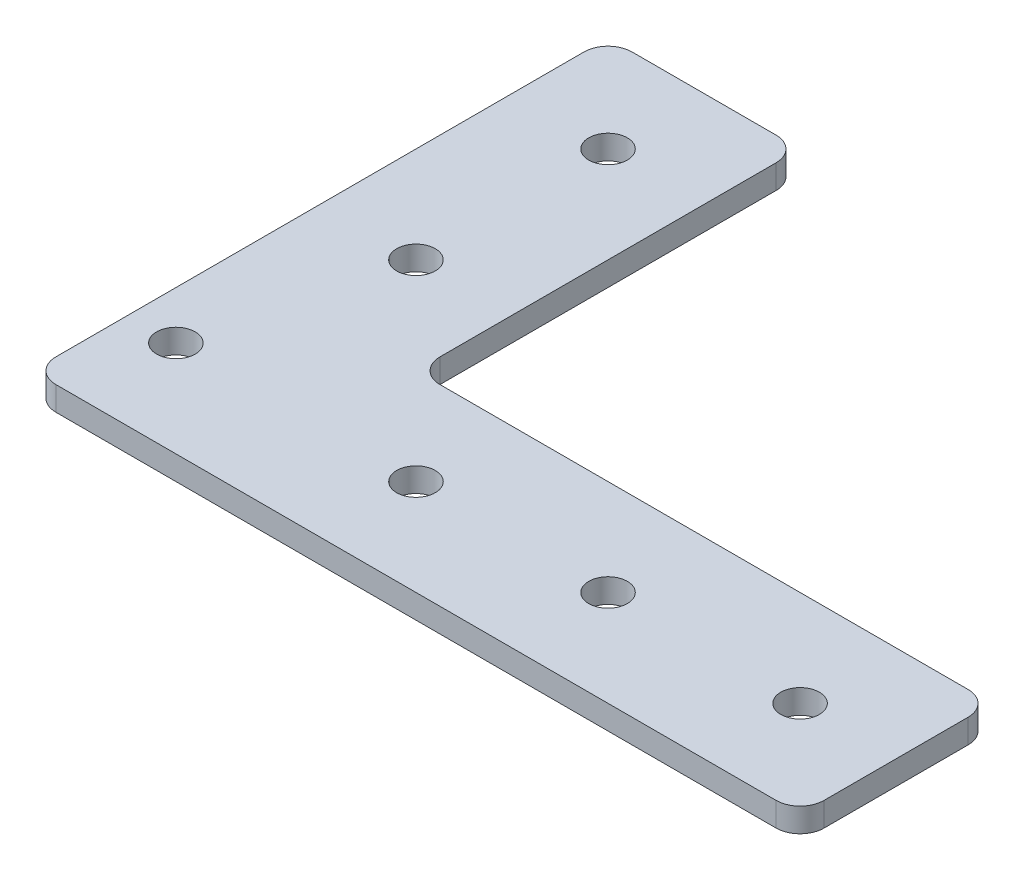
ISO-10303-21;
HEADER;
FILE_DESCRIPTION(('STEP AP214'),'2;1');
FILE_NAME('part.step','',(''),(''),'','','');
FILE_SCHEMA(('AUTOMOTIVE_DESIGN { 1 0 10303 214 1 1 1 1 }'));
ENDSEC;
DATA;
#1=APPLICATION_CONTEXT('core data for automotive mechanical design processes');
#2=APPLICATION_PROTOCOL_DEFINITION('international standard','automotive_design',2000,#1);
#3=PRODUCT_CONTEXT('',#1,'mechanical');
#4=PRODUCT('Part','Part','',(#3));
#5=PRODUCT_RELATED_PRODUCT_CATEGORY('part','',(#4));
#6=PRODUCT_DEFINITION_FORMATION('','',#4);
#7=PRODUCT_DEFINITION_CONTEXT('part definition',#1,'design');
#8=PRODUCT_DEFINITION('design','',#6,#7);
#9=PRODUCT_DEFINITION_SHAPE('','',#8);
#10=(LENGTH_UNIT() NAMED_UNIT(*) SI_UNIT(.MILLI.,.METRE.));
#11=(NAMED_UNIT(*) PLANE_ANGLE_UNIT() SI_UNIT($,.RADIAN.));
#12=(NAMED_UNIT(*) SI_UNIT($,.STERADIAN.) SOLID_ANGLE_UNIT());
#13=UNCERTAINTY_MEASURE_WITH_UNIT(LENGTH_MEASURE(1.E-05),#10,'distance_accuracy_value','');
#14=(GEOMETRIC_REPRESENTATION_CONTEXT(3) GLOBAL_UNCERTAINTY_ASSIGNED_CONTEXT((#13)) GLOBAL_UNIT_ASSIGNED_CONTEXT((#10,
#11,#12)) REPRESENTATION_CONTEXT('',''));
#15=CARTESIAN_POINT('',(0.,0.,0.));
#16=DIRECTION('',(0.,0.,1.));
#17=DIRECTION('',(1.,0.,0.));
#18=AXIS2_PLACEMENT_3D('',#15,#16,#17);
#19=CARTESIAN_POINT('',(101.6,3.175,0.));
#20=DIRECTION('',(0.,0.,-1.));
#21=DIRECTION('',(-1.,0.,0.));
#22=AXIS2_PLACEMENT_3D('',#19,#20,#21);
#23=PLANE('',#22);
#24=DIRECTION('',(1.,0.,0.));
#25=VECTOR('',#24,1.);
#26=CARTESIAN_POINT('',(101.6,3.175,0.));
#27=LINE('',#26,#25);
#28=CARTESIAN_POINT('',(3.175,3.175,0.));
#29=VERTEX_POINT('',#28);
#30=CARTESIAN_POINT('',(98.425,3.175,0.));
#31=VERTEX_POINT('',#30);
#32=EDGE_CURVE('E194',#29,#31,#27,.T.);
#33=ORIENTED_EDGE('',*,*,#32,.F.);
#34=DIRECTION('',(0.,-1.,0.));
#35=VECTOR('',#34,1.);
#36=CARTESIAN_POINT('',(3.175,3.175,0.));
#37=LINE('',#36,#35);
#38=CARTESIAN_POINT('',(3.175,0.,0.));
#39=VERTEX_POINT('',#38);
#40=EDGE_CURVE('E218',#29,#39,#37,.T.);
#41=ORIENTED_EDGE('',*,*,#40,.T.);
#42=DIRECTION('',(1.,0.,0.));
#43=VECTOR('',#42,1.);
#44=CARTESIAN_POINT('',(101.6,0.,0.));
#45=LINE('',#44,#43);
#46=CARTESIAN_POINT('',(98.425,0.,0.));
#47=VERTEX_POINT('',#46);
#48=EDGE_CURVE('E193',#39,#47,#45,.T.);
#49=ORIENTED_EDGE('',*,*,#48,.T.);
#50=DIRECTION('',(0.,-1.,0.));
#51=VECTOR('',#50,1.);
#52=CARTESIAN_POINT('',(98.425,3.175,0.));
#53=LINE('',#52,#51);
#54=EDGE_CURVE('E216',#47,#31,#53,.F.);
#55=ORIENTED_EDGE('',*,*,#54,.T.);
#56=EDGE_LOOP('',(#33,#41,#49,#55));
#57=FACE_BOUND('',#56,.T.);
#58=ADVANCED_FACE('F34',(#57),#23,.F.);
#59=CARTESIAN_POINT('',(101.6,3.175,-25.4));
#60=DIRECTION('',(-1.,0.,0.));
#61=DIRECTION('',(0.,0.,1.));
#62=AXIS2_PLACEMENT_3D('',#59,#60,#61);
#63=PLANE('',#62);
#64=DIRECTION('',(0.,0.,-1.));
#65=VECTOR('',#64,1.);
#66=CARTESIAN_POINT('',(101.6,3.175,-25.4));
#67=LINE('',#66,#65);
#68=CARTESIAN_POINT('',(101.6,3.175,-3.175));
#69=VERTEX_POINT('',#68);
#70=CARTESIAN_POINT('',(101.6,3.175,-22.225));
#71=VERTEX_POINT('',#70);
#72=EDGE_CURVE('E197',#69,#71,#67,.T.);
#73=ORIENTED_EDGE('',*,*,#72,.F.);
#74=DIRECTION('',(0.,-1.,0.));
#75=VECTOR('',#74,1.);
#76=CARTESIAN_POINT('',(101.6,3.175,-3.175));
#77=LINE('',#76,#75);
#78=CARTESIAN_POINT('',(101.6,0.,-3.175));
#79=VERTEX_POINT('',#78);
#80=EDGE_CURVE('E246',#69,#79,#77,.T.);
#81=ORIENTED_EDGE('',*,*,#80,.T.);
#82=DIRECTION('',(0.,0.,-1.));
#83=VECTOR('',#82,1.);
#84=CARTESIAN_POINT('',(101.6,0.,-25.4));
#85=LINE('',#84,#83);
#86=CARTESIAN_POINT('',(101.6,0.,-22.225));
#87=VERTEX_POINT('',#86);
#88=EDGE_CURVE('E206',#79,#87,#85,.T.);
#89=ORIENTED_EDGE('',*,*,#88,.T.);
#90=DIRECTION('',(0.,-1.,0.));
#91=VECTOR('',#90,1.);
#92=CARTESIAN_POINT('',(101.6,3.175,-22.225));
#93=LINE('',#92,#91);
#94=EDGE_CURVE('E244',#87,#71,#93,.F.);
#95=ORIENTED_EDGE('',*,*,#94,.T.);
#96=EDGE_LOOP('',(#73,#81,#89,#95));
#97=FACE_BOUND('',#96,.T.);
#98=ADVANCED_FACE('F282',(#97),#63,.F.);
#99=CARTESIAN_POINT('',(0.,3.175,-76.2));
#100=DIRECTION('',(0.,0.,1.));
#101=DIRECTION('',(1.,0.,0.));
#102=AXIS2_PLACEMENT_3D('',#99,#100,#101);
#103=PLANE('',#102);
#104=DIRECTION('',(-1.,0.,0.));
#105=VECTOR('',#104,1.);
#106=CARTESIAN_POINT('',(0.,3.175,-76.2));
#107=LINE('',#106,#105);
#108=CARTESIAN_POINT('',(22.225,3.175,-76.2));
#109=VERTEX_POINT('',#108);
#110=CARTESIAN_POINT('',(3.175,3.175,-76.2));
#111=VERTEX_POINT('',#110);
#112=EDGE_CURVE('E200',#109,#111,#107,.T.);
#113=ORIENTED_EDGE('',*,*,#112,.F.);
#114=DIRECTION('',(0.,-1.,0.));
#115=VECTOR('',#114,1.);
#116=CARTESIAN_POINT('',(22.225,3.175,-76.2));
#117=LINE('',#116,#115);
#118=CARTESIAN_POINT('',(22.225,0.,-76.2));
#119=VERTEX_POINT('',#118);
#120=EDGE_CURVE('E131',#109,#119,#117,.T.);
#121=ORIENTED_EDGE('',*,*,#120,.T.);
#122=DIRECTION('',(-1.,0.,0.));
#123=VECTOR('',#122,1.);
#124=CARTESIAN_POINT('',(0.,0.,-76.2));
#125=LINE('',#124,#123);
#126=CARTESIAN_POINT('',(3.175,0.,-76.2));
#127=VERTEX_POINT('',#126);
#128=EDGE_CURVE('E209',#119,#127,#125,.T.);
#129=ORIENTED_EDGE('',*,*,#128,.T.);
#130=DIRECTION('',(0.,-1.,0.));
#131=VECTOR('',#130,1.);
#132=CARTESIAN_POINT('',(3.175,3.175,-76.2));
#133=LINE('',#132,#131);
#134=EDGE_CURVE('E49',#127,#111,#133,.F.);
#135=ORIENTED_EDGE('',*,*,#134,.T.);
#136=EDGE_LOOP('',(#113,#121,#129,#135));
#137=FACE_BOUND('',#136,.T.);
#138=ADVANCED_FACE('F253',(#137),#103,.F.);
#139=CARTESIAN_POINT('',(0.,3.175,0.));
#140=DIRECTION('',(1.,0.,0.));
#141=DIRECTION('',(0.,0.,-1.));
#142=AXIS2_PLACEMENT_3D('',#139,#140,#141);
#143=PLANE('',#142);
#144=DIRECTION('',(0.,0.,1.));
#145=VECTOR('',#144,1.);
#146=CARTESIAN_POINT('',(0.,0.,0.));
#147=LINE('',#146,#145);
#148=CARTESIAN_POINT('',(0.,0.,-73.025));
#149=VERTEX_POINT('',#148);
#150=CARTESIAN_POINT('',(0.,0.,-3.175));
#151=VERTEX_POINT('',#150);
#152=EDGE_CURVE('E198',#149,#151,#147,.T.);
#153=ORIENTED_EDGE('',*,*,#152,.T.);
#154=DIRECTION('',(0.,-1.,0.));
#155=VECTOR('',#154,1.);
#156=CARTESIAN_POINT('',(0.,3.175,-3.175));
#157=LINE('',#156,#155);
#158=CARTESIAN_POINT('',(0.,3.175,-3.175));
#159=VERTEX_POINT('',#158);
#160=EDGE_CURVE('E234',#151,#159,#157,.F.);
#161=ORIENTED_EDGE('',*,*,#160,.T.);
#162=DIRECTION('',(0.,0.,1.));
#163=VECTOR('',#162,1.);
#164=CARTESIAN_POINT('',(0.,3.175,0.));
#165=LINE('',#164,#163);
#166=CARTESIAN_POINT('',(0.,3.175,-73.025));
#167=VERTEX_POINT('',#166);
#168=EDGE_CURVE('E202',#167,#159,#165,.T.);
#169=ORIENTED_EDGE('',*,*,#168,.F.);
#170=DIRECTION('',(0.,-1.,0.));
#171=VECTOR('',#170,1.);
#172=CARTESIAN_POINT('',(0.,3.175,-73.025));
#173=LINE('',#172,#171);
#174=EDGE_CURVE('E231',#167,#149,#173,.T.);
#175=ORIENTED_EDGE('',*,*,#174,.T.);
#176=EDGE_LOOP('',(#153,#161,#169,#175));
#177=FACE_BOUND('',#176,.T.);
#178=ADVANCED_FACE('F266',(#177),#143,.F.);
#179=CARTESIAN_POINT('',(0.,3.175,0.));
#180=DIRECTION('',(0.,-1.,0.));
#181=DIRECTION('',(0.,0.,-1.));
#182=AXIS2_PLACEMENT_3D('',#179,#180,#181);
#183=PLANE('',#182);
#184=CARTESIAN_POINT('',(6.35,3.175,-12.7));
#185=DIRECTION('',(0.,1.,0.));
#186=DIRECTION('',(0.,0.,1.));
#187=AXIS2_PLACEMENT_3D('',#184,#185,#186);
#188=CIRCLE('',#187,2.55269999999999);
#189=CARTESIAN_POINT('',(6.35,3.175,-10.1473));
#190=VERTEX_POINT('',#189);
#191=EDGE_CURVE('E157',#190,#190,#188,.T.);
#192=ORIENTED_EDGE('',*,*,#191,.F.);
#193=EDGE_LOOP('',(#192));
#194=FACE_BOUND('',#193,.T.);
#195=CARTESIAN_POINT('',(12.7,3.175,-63.5));
#196=DIRECTION('',(0.,1.,0.));
#197=DIRECTION('',(0.,0.,1.));
#198=AXIS2_PLACEMENT_3D('',#195,#196,#197);
#199=CIRCLE('',#198,2.5527);
#200=CARTESIAN_POINT('',(12.7,3.175,-60.9473));
#201=VERTEX_POINT('',#200);
#202=EDGE_CURVE('E163',#201,#201,#199,.T.);
#203=ORIENTED_EDGE('',*,*,#202,.F.);
#204=EDGE_LOOP('',(#203));
#205=FACE_BOUND('',#204,.T.);
#206=CARTESIAN_POINT('',(12.7,3.175,-38.1));
#207=DIRECTION('',(0.,1.,0.));
#208=DIRECTION('',(0.,0.,1.));
#209=AXIS2_PLACEMENT_3D('',#206,#207,#208);
#210=CIRCLE('',#209,2.5527);
#211=CARTESIAN_POINT('',(12.7,3.175,-35.5473));
#212=VERTEX_POINT('',#211);
#213=EDGE_CURVE('E169',#212,#212,#210,.T.);
#214=ORIENTED_EDGE('',*,*,#213,.F.);
#215=EDGE_LOOP('',(#214));
#216=FACE_BOUND('',#215,.T.);
#217=CARTESIAN_POINT('',(38.1,3.175,-12.7));
#218=DIRECTION('',(0.,1.,0.));
#219=DIRECTION('',(0.,0.,1.));
#220=AXIS2_PLACEMENT_3D('',#217,#218,#219);
#221=CIRCLE('',#220,2.5527);
#222=CARTESIAN_POINT('',(38.1,3.175,-10.1473));
#223=VERTEX_POINT('',#222);
#224=EDGE_CURVE('E175',#223,#223,#221,.T.);
#225=ORIENTED_EDGE('',*,*,#224,.F.);
#226=EDGE_LOOP('',(#225));
#227=FACE_BOUND('',#226,.T.);
#228=CARTESIAN_POINT('',(63.5,3.175,-12.7));
#229=DIRECTION('',(0.,1.,0.));
#230=DIRECTION('',(0.,0.,1.));
#231=AXIS2_PLACEMENT_3D('',#228,#229,#230);
#232=CIRCLE('',#231,2.55269999999999);
#233=CARTESIAN_POINT('',(63.5,3.175,-10.1473));
#234=VERTEX_POINT('',#233);
#235=EDGE_CURVE('E181',#234,#234,#232,.T.);
#236=ORIENTED_EDGE('',*,*,#235,.F.);
#237=EDGE_LOOP('',(#236));
#238=FACE_BOUND('',#237,.T.);
#239=CARTESIAN_POINT('',(88.9,3.175,-12.7));
#240=DIRECTION('',(0.,1.,0.));
#241=DIRECTION('',(0.,0.,1.));
#242=AXIS2_PLACEMENT_3D('',#239,#240,#241);
#243=CIRCLE('',#242,2.55269999999999);
#244=CARTESIAN_POINT('',(88.9,3.175,-10.1473));
#245=VERTEX_POINT('',#244);
#246=EDGE_CURVE('E187',#245,#245,#243,.T.);
#247=ORIENTED_EDGE('',*,*,#246,.F.);
#248=EDGE_LOOP('',(#247));
#249=FACE_BOUND('',#248,.T.);
#250=ORIENTED_EDGE('',*,*,#168,.T.);
#251=CARTESIAN_POINT('',(3.175,3.175,-3.175));
#252=DIRECTION('',(0.,-1.,0.));
#253=DIRECTION('',(0.,0.,-1.));
#254=AXIS2_PLACEMENT_3D('',#251,#252,#253);
#255=CIRCLE('',#254,3.175);
#256=EDGE_CURVE('E242',#159,#29,#255,.F.);
#257=ORIENTED_EDGE('',*,*,#256,.T.);
#258=ORIENTED_EDGE('',*,*,#32,.T.);
#259=CARTESIAN_POINT('',(98.425,3.175,-3.175));
#260=DIRECTION('',(0.,-1.,0.));
#261=DIRECTION('',(0.,0.,-1.));
#262=AXIS2_PLACEMENT_3D('',#259,#260,#261);
#263=CIRCLE('',#262,3.175);
#264=EDGE_CURVE('E240',#31,#69,#263,.F.);
#265=ORIENTED_EDGE('',*,*,#264,.T.);
#266=ORIENTED_EDGE('',*,*,#72,.T.);
#267=CARTESIAN_POINT('',(98.425,3.175,-22.225));
#268=DIRECTION('',(0.,-1.,0.));
#269=DIRECTION('',(0.,0.,-1.));
#270=AXIS2_PLACEMENT_3D('',#267,#268,#269);
#271=CIRCLE('',#270,3.175);
#272=CARTESIAN_POINT('',(98.425,3.175,-25.4));
#273=VERTEX_POINT('',#272);
#274=EDGE_CURVE('E148',#71,#273,#271,.F.);
#275=ORIENTED_EDGE('',*,*,#274,.T.);
#276=DIRECTION('',(1.,0.,0.));
#277=VECTOR('',#276,1.);
#278=CARTESIAN_POINT('',(25.4,3.175,-25.4));
#279=LINE('',#278,#277);
#280=CARTESIAN_POINT('',(28.575,3.175,-25.4));
#281=VERTEX_POINT('',#280);
#282=EDGE_CURVE('E137',#281,#273,#279,.T.);
#283=ORIENTED_EDGE('',*,*,#282,.F.);
#284=CARTESIAN_POINT('',(28.575,3.175,-28.575));
#285=DIRECTION('',(0.,-1.,0.));
#286=DIRECTION('',(0.,0.,-1.));
#287=AXIS2_PLACEMENT_3D('',#284,#285,#286);
#288=CIRCLE('',#287,3.175);
#289=CARTESIAN_POINT('',(25.4,3.175,-28.575));
#290=VERTEX_POINT('',#289);
#291=EDGE_CURVE('E42',#281,#290,#288,.T.);
#292=ORIENTED_EDGE('',*,*,#291,.T.);
#293=DIRECTION('',(0.,0.,1.));
#294=VECTOR('',#293,1.);
#295=CARTESIAN_POINT('',(25.4,3.175,-76.2));
#296=LINE('',#295,#294);
#297=CARTESIAN_POINT('',(25.4,3.175,-73.025));
#298=VERTEX_POINT('',#297);
#299=EDGE_CURVE('E150',#298,#290,#296,.T.);
#300=ORIENTED_EDGE('',*,*,#299,.F.);
#301=CARTESIAN_POINT('',(22.225,3.175,-73.025));
#302=DIRECTION('',(0.,-1.,0.));
#303=DIRECTION('',(0.,0.,-1.));
#304=AXIS2_PLACEMENT_3D('',#301,#302,#303);
#305=CIRCLE('',#304,3.175);
#306=EDGE_CURVE('E56',#298,#109,#305,.F.);
#307=ORIENTED_EDGE('',*,*,#306,.T.);
#308=ORIENTED_EDGE('',*,*,#112,.T.);
#309=CARTESIAN_POINT('',(3.175,3.175,-73.025));
#310=DIRECTION('',(0.,-1.,0.));
#311=DIRECTION('',(0.,0.,-1.));
#312=AXIS2_PLACEMENT_3D('',#309,#310,#311);
#313=CIRCLE('',#312,3.175);
#314=EDGE_CURVE('E236',#111,#167,#313,.F.);
#315=ORIENTED_EDGE('',*,*,#314,.T.);
#316=EDGE_LOOP('',(#250,#257,#258,#265,#266,#275,#283,#292,#300,#307,#308,#315));
#317=FACE_BOUND('',#316,.T.);
#318=ADVANCED_FACE('F145',(#194,#205,#216,#227,#238,#249,#317),#183,.F.);
#319=CARTESIAN_POINT('',(0.,0.,0.));
#320=DIRECTION('',(0.,-1.,0.));
#321=DIRECTION('',(0.,0.,-1.));
#322=AXIS2_PLACEMENT_3D('',#319,#320,#321);
#323=PLANE('',#322);
#324=ORIENTED_EDGE('',*,*,#48,.F.);
#325=CARTESIAN_POINT('',(3.175,0.,-3.175));
#326=DIRECTION('',(0.,-1.,0.));
#327=DIRECTION('',(0.,0.,-1.));
#328=AXIS2_PLACEMENT_3D('',#325,#326,#327);
#329=CIRCLE('',#328,3.175);
#330=EDGE_CURVE('E229',#39,#151,#329,.T.);
#331=ORIENTED_EDGE('',*,*,#330,.T.);
#332=ORIENTED_EDGE('',*,*,#152,.F.);
#333=CARTESIAN_POINT('',(3.175,0.,-73.025));
#334=DIRECTION('',(0.,-1.,0.));
#335=DIRECTION('',(0.,0.,-1.));
#336=AXIS2_PLACEMENT_3D('',#333,#334,#335);
#337=CIRCLE('',#336,3.175);
#338=EDGE_CURVE('E221',#149,#127,#337,.T.);
#339=ORIENTED_EDGE('',*,*,#338,.T.);
#340=ORIENTED_EDGE('',*,*,#128,.F.);
#341=CARTESIAN_POINT('',(22.225,0.,-73.025));
#342=DIRECTION('',(0.,-1.,0.));
#343=DIRECTION('',(0.,0.,-1.));
#344=AXIS2_PLACEMENT_3D('',#341,#342,#343);
#345=CIRCLE('',#344,3.175);
#346=CARTESIAN_POINT('',(25.4,0.,-73.025));
#347=VERTEX_POINT('',#346);
#348=EDGE_CURVE('E223',#119,#347,#345,.T.);
#349=ORIENTED_EDGE('',*,*,#348,.T.);
#350=DIRECTION('',(0.,0.,1.));
#351=VECTOR('',#350,1.);
#352=CARTESIAN_POINT('',(25.4,0.,-76.2));
#353=LINE('',#352,#351);
#354=CARTESIAN_POINT('',(25.4,0.,-28.575));
#355=VERTEX_POINT('',#354);
#356=EDGE_CURVE('E149',#347,#355,#353,.T.);
#357=ORIENTED_EDGE('',*,*,#356,.T.);
#358=CARTESIAN_POINT('',(28.575,0.,-28.575));
#359=DIRECTION('',(0.,-1.,0.));
#360=DIRECTION('',(0.,0.,-1.));
#361=AXIS2_PLACEMENT_3D('',#358,#359,#360);
#362=CIRCLE('',#361,3.175);
#363=CARTESIAN_POINT('',(28.575,0.,-25.4));
#364=VERTEX_POINT('',#363);
#365=EDGE_CURVE('E11',#355,#364,#362,.F.);
#366=ORIENTED_EDGE('',*,*,#365,.T.);
#367=DIRECTION('',(1.,0.,0.));
#368=VECTOR('',#367,1.);
#369=CARTESIAN_POINT('',(25.4,0.,-25.4));
#370=LINE('',#369,#368);
#371=CARTESIAN_POINT('',(98.425,0.,-25.4));
#372=VERTEX_POINT('',#371);
#373=EDGE_CURVE('E140',#364,#372,#370,.T.);
#374=ORIENTED_EDGE('',*,*,#373,.T.);
#375=CARTESIAN_POINT('',(98.425,0.,-22.225));
#376=DIRECTION('',(0.,-1.,0.));
#377=DIRECTION('',(0.,0.,-1.));
#378=AXIS2_PLACEMENT_3D('',#375,#376,#377);
#379=CIRCLE('',#378,3.175);
#380=EDGE_CURVE('E225',#372,#87,#379,.T.);
#381=ORIENTED_EDGE('',*,*,#380,.T.);
#382=ORIENTED_EDGE('',*,*,#88,.F.);
#383=CARTESIAN_POINT('',(98.425,0.,-3.175));
#384=DIRECTION('',(0.,-1.,0.));
#385=DIRECTION('',(0.,0.,-1.));
#386=AXIS2_PLACEMENT_3D('',#383,#384,#385);
#387=CIRCLE('',#386,3.175);
#388=EDGE_CURVE('E227',#79,#47,#387,.T.);
#389=ORIENTED_EDGE('',*,*,#388,.T.);
#390=EDGE_LOOP('',(#324,#331,#332,#339,#340,#349,#357,#366,#374,#381,#382,#389));
#391=FACE_BOUND('',#390,.T.);
#392=CARTESIAN_POINT('',(6.35,0.,-12.7));
#393=DIRECTION('',(0.,1.,0.));
#394=DIRECTION('',(0.,0.,1.));
#395=AXIS2_PLACEMENT_3D('',#392,#393,#394);
#396=CIRCLE('',#395,2.5527);
#397=CARTESIAN_POINT('',(6.35,0.,-10.1473));
#398=VERTEX_POINT('',#397);
#399=EDGE_CURVE('E160',#398,#398,#396,.T.);
#400=ORIENTED_EDGE('',*,*,#399,.T.);
#401=EDGE_LOOP('',(#400));
#402=FACE_BOUND('',#401,.T.);
#403=CARTESIAN_POINT('',(12.7,0.,-63.5));
#404=DIRECTION('',(0.,1.,0.));
#405=DIRECTION('',(0.,0.,1.));
#406=AXIS2_PLACEMENT_3D('',#403,#404,#405);
#407=CIRCLE('',#406,2.5527);
#408=CARTESIAN_POINT('',(12.7,0.,-60.9473));
#409=VERTEX_POINT('',#408);
#410=EDGE_CURVE('E166',#409,#409,#407,.T.);
#411=ORIENTED_EDGE('',*,*,#410,.T.);
#412=EDGE_LOOP('',(#411));
#413=FACE_BOUND('',#412,.T.);
#414=CARTESIAN_POINT('',(12.7,0.,-38.1));
#415=DIRECTION('',(0.,1.,0.));
#416=DIRECTION('',(0.,0.,1.));
#417=AXIS2_PLACEMENT_3D('',#414,#415,#416);
#418=CIRCLE('',#417,2.5527);
#419=CARTESIAN_POINT('',(12.7,0.,-35.5473));
#420=VERTEX_POINT('',#419);
#421=EDGE_CURVE('E172',#420,#420,#418,.T.);
#422=ORIENTED_EDGE('',*,*,#421,.T.);
#423=EDGE_LOOP('',(#422));
#424=FACE_BOUND('',#423,.T.);
#425=CARTESIAN_POINT('',(38.1,0.,-12.7));
#426=DIRECTION('',(0.,1.,0.));
#427=DIRECTION('',(0.,0.,1.));
#428=AXIS2_PLACEMENT_3D('',#425,#426,#427);
#429=CIRCLE('',#428,2.5527);
#430=CARTESIAN_POINT('',(38.1,0.,-10.1473));
#431=VERTEX_POINT('',#430);
#432=EDGE_CURVE('E178',#431,#431,#429,.T.);
#433=ORIENTED_EDGE('',*,*,#432,.T.);
#434=EDGE_LOOP('',(#433));
#435=FACE_BOUND('',#434,.T.);
#436=CARTESIAN_POINT('',(63.5,0.,-12.7));
#437=DIRECTION('',(0.,1.,0.));
#438=DIRECTION('',(0.,0.,1.));
#439=AXIS2_PLACEMENT_3D('',#436,#437,#438);
#440=CIRCLE('',#439,2.55269999999999);
#441=CARTESIAN_POINT('',(63.5,0.,-10.1473));
#442=VERTEX_POINT('',#441);
#443=EDGE_CURVE('E184',#442,#442,#440,.T.);
#444=ORIENTED_EDGE('',*,*,#443,.T.);
#445=EDGE_LOOP('',(#444));
#446=FACE_BOUND('',#445,.T.);
#447=CARTESIAN_POINT('',(88.9,0.,-12.7));
#448=DIRECTION('',(0.,1.,0.));
#449=DIRECTION('',(0.,0.,1.));
#450=AXIS2_PLACEMENT_3D('',#447,#448,#449);
#451=CIRCLE('',#450,2.55269999999999);
#452=CARTESIAN_POINT('',(88.9,0.,-10.1473));
#453=VERTEX_POINT('',#452);
#454=EDGE_CURVE('E190',#453,#453,#451,.T.);
#455=ORIENTED_EDGE('',*,*,#454,.T.);
#456=EDGE_LOOP('',(#455));
#457=FACE_BOUND('',#456,.T.);
#458=ADVANCED_FACE('F257',(#391,#402,#413,#424,#435,#446,#457),#323,.T.);
#459=CARTESIAN_POINT('',(88.9,3.175,-12.7));
#460=DIRECTION('',(0.,1.,0.));
#461=DIRECTION('',(0.,0.,1.));
#462=AXIS2_PLACEMENT_3D('',#459,#460,#461);
#463=CYLINDRICAL_SURFACE('',#462,2.55269999999999);
#464=ORIENTED_EDGE('',*,*,#454,.F.);
#465=EDGE_LOOP('',(#464));
#466=FACE_BOUND('',#465,.T.);
#467=ORIENTED_EDGE('',*,*,#246,.T.);
#468=EDGE_LOOP('',(#467));
#469=FACE_BOUND('',#468,.T.);
#470=ADVANCED_FACE('F400',(#466,#469),#463,.F.);
#471=CARTESIAN_POINT('',(63.5,3.175,-12.7));
#472=DIRECTION('',(0.,1.,0.));
#473=DIRECTION('',(0.,0.,1.));
#474=AXIS2_PLACEMENT_3D('',#471,#472,#473);
#475=CYLINDRICAL_SURFACE('',#474,2.55269999999999);
#476=ORIENTED_EDGE('',*,*,#443,.F.);
#477=EDGE_LOOP('',(#476));
#478=FACE_BOUND('',#477,.T.);
#479=ORIENTED_EDGE('',*,*,#235,.T.);
#480=EDGE_LOOP('',(#479));
#481=FACE_BOUND('',#480,.T.);
#482=ADVANCED_FACE('F391',(#478,#481),#475,.F.);
#483=CARTESIAN_POINT('',(38.1,3.175,-12.7));
#484=DIRECTION('',(0.,1.,0.));
#485=DIRECTION('',(0.,0.,1.));
#486=AXIS2_PLACEMENT_3D('',#483,#484,#485);
#487=CYLINDRICAL_SURFACE('',#486,2.5527);
#488=ORIENTED_EDGE('',*,*,#432,.F.);
#489=EDGE_LOOP('',(#488));
#490=FACE_BOUND('',#489,.T.);
#491=ORIENTED_EDGE('',*,*,#224,.T.);
#492=EDGE_LOOP('',(#491));
#493=FACE_BOUND('',#492,.T.);
#494=ADVANCED_FACE('F382',(#490,#493),#487,.F.);
#495=CARTESIAN_POINT('',(12.7,3.175,-38.1));
#496=DIRECTION('',(0.,1.,0.));
#497=DIRECTION('',(0.,0.,1.));
#498=AXIS2_PLACEMENT_3D('',#495,#496,#497);
#499=CYLINDRICAL_SURFACE('',#498,2.5527);
#500=ORIENTED_EDGE('',*,*,#421,.F.);
#501=EDGE_LOOP('',(#500));
#502=FACE_BOUND('',#501,.T.);
#503=ORIENTED_EDGE('',*,*,#213,.T.);
#504=EDGE_LOOP('',(#503));
#505=FACE_BOUND('',#504,.T.);
#506=ADVANCED_FACE('F373',(#502,#505),#499,.F.);
#507=CARTESIAN_POINT('',(12.7,3.175,-63.5));
#508=DIRECTION('',(0.,1.,0.));
#509=DIRECTION('',(0.,0.,1.));
#510=AXIS2_PLACEMENT_3D('',#507,#508,#509);
#511=CYLINDRICAL_SURFACE('',#510,2.5527);
#512=ORIENTED_EDGE('',*,*,#410,.F.);
#513=EDGE_LOOP('',(#512));
#514=FACE_BOUND('',#513,.T.);
#515=ORIENTED_EDGE('',*,*,#202,.T.);
#516=EDGE_LOOP('',(#515));
#517=FACE_BOUND('',#516,.T.);
#518=ADVANCED_FACE('F364',(#514,#517),#511,.F.);
#519=CARTESIAN_POINT('',(6.35,3.175,-12.7));
#520=DIRECTION('',(0.,1.,0.));
#521=DIRECTION('',(0.,0.,1.));
#522=AXIS2_PLACEMENT_3D('',#519,#520,#521);
#523=CYLINDRICAL_SURFACE('',#522,2.55269999999999);
#524=ORIENTED_EDGE('',*,*,#399,.F.);
#525=EDGE_LOOP('',(#524));
#526=FACE_BOUND('',#525,.T.);
#527=ORIENTED_EDGE('',*,*,#191,.T.);
#528=EDGE_LOOP('',(#527));
#529=FACE_BOUND('',#528,.T.);
#530=ADVANCED_FACE('F355',(#526,#529),#523,.F.);
#531=CARTESIAN_POINT('',(25.4,0.,-25.4));
#532=DIRECTION('',(0.,0.,1.));
#533=DIRECTION('',(1.,0.,0.));
#534=AXIS2_PLACEMENT_3D('',#531,#532,#533);
#535=PLANE('',#534);
#536=ORIENTED_EDGE('',*,*,#373,.F.);
#537=DIRECTION('',(0.,1.,0.));
#538=VECTOR('',#537,1.);
#539=CARTESIAN_POINT('',(28.575,3.175,-25.4));
#540=LINE('',#539,#538);
#541=EDGE_CURVE('E127',#364,#281,#540,.T.);
#542=ORIENTED_EDGE('',*,*,#541,.T.);
#543=ORIENTED_EDGE('',*,*,#282,.T.);
#544=DIRECTION('',(0.,-1.,0.));
#545=VECTOR('',#544,1.);
#546=CARTESIAN_POINT('',(98.425,0.,-25.4));
#547=LINE('',#546,#545);
#548=EDGE_CURVE('E142',#273,#372,#547,.T.);
#549=ORIENTED_EDGE('',*,*,#548,.T.);
#550=EDGE_LOOP('',(#536,#542,#543,#549));
#551=FACE_BOUND('',#550,.T.);
#552=ADVANCED_FACE('F135',(#551),#535,.F.);
#553=CARTESIAN_POINT('',(25.4,0.,-76.2));
#554=DIRECTION('',(-1.,0.,0.));
#555=DIRECTION('',(0.,0.,1.));
#556=AXIS2_PLACEMENT_3D('',#553,#554,#555);
#557=PLANE('',#556);
#558=ORIENTED_EDGE('',*,*,#299,.T.);
#559=DIRECTION('',(0.,1.,0.));
#560=VECTOR('',#559,1.);
#561=CARTESIAN_POINT('',(25.4,0.,-28.575));
#562=LINE('',#561,#560);
#563=EDGE_CURVE('E128',#290,#355,#562,.F.);
#564=ORIENTED_EDGE('',*,*,#563,.T.);
#565=ORIENTED_EDGE('',*,*,#356,.F.);
#566=DIRECTION('',(0.,-1.,0.));
#567=VECTOR('',#566,1.);
#568=CARTESIAN_POINT('',(25.4,0.,-73.025));
#569=LINE('',#568,#567);
#570=EDGE_CURVE('E141',#347,#298,#569,.F.);
#571=ORIENTED_EDGE('',*,*,#570,.T.);
#572=EDGE_LOOP('',(#558,#564,#565,#571));
#573=FACE_BOUND('',#572,.T.);
#574=ADVANCED_FACE('F288',(#573),#557,.F.);
#575=CARTESIAN_POINT('',(28.575,0.,-28.575));
#576=DIRECTION('',(0.,-1.,0.));
#577=DIRECTION('',(0.,0.,-1.));
#578=AXIS2_PLACEMENT_3D('',#575,#576,#577);
#579=CYLINDRICAL_SURFACE('',#578,3.175);
#580=ORIENTED_EDGE('',*,*,#365,.F.);
#581=ORIENTED_EDGE('',*,*,#563,.F.);
#582=ORIENTED_EDGE('',*,*,#291,.F.);
#583=ORIENTED_EDGE('',*,*,#541,.F.);
#584=EDGE_LOOP('',(#580,#581,#582,#583));
#585=FACE_BOUND('',#584,.T.);
#586=ADVANCED_FACE('F126',(#585),#579,.F.);
#587=CARTESIAN_POINT('',(3.175,3.175,-3.175));
#588=DIRECTION('',(0.,-1.,0.));
#589=DIRECTION('',(0.,0.,-1.));
#590=AXIS2_PLACEMENT_3D('',#587,#588,#589);
#591=CYLINDRICAL_SURFACE('',#590,3.175);
#592=ORIENTED_EDGE('',*,*,#256,.F.);
#593=ORIENTED_EDGE('',*,*,#160,.F.);
#594=ORIENTED_EDGE('',*,*,#330,.F.);
#595=ORIENTED_EDGE('',*,*,#40,.F.);
#596=EDGE_LOOP('',(#592,#593,#594,#595));
#597=FACE_BOUND('',#596,.T.);
#598=ADVANCED_FACE('F272',(#597),#591,.T.);
#599=CARTESIAN_POINT('',(98.425,3.175,-3.175));
#600=DIRECTION('',(0.,-1.,0.));
#601=DIRECTION('',(0.,0.,-1.));
#602=AXIS2_PLACEMENT_3D('',#599,#600,#601);
#603=CYLINDRICAL_SURFACE('',#602,3.175);
#604=ORIENTED_EDGE('',*,*,#264,.F.);
#605=ORIENTED_EDGE('',*,*,#54,.F.);
#606=ORIENTED_EDGE('',*,*,#388,.F.);
#607=ORIENTED_EDGE('',*,*,#80,.F.);
#608=EDGE_LOOP('',(#604,#605,#606,#607));
#609=FACE_BOUND('',#608,.T.);
#610=ADVANCED_FACE('F279',(#609),#603,.T.);
#611=CARTESIAN_POINT('',(98.425,0.,-22.225));
#612=DIRECTION('',(0.,-1.,0.));
#613=DIRECTION('',(0.,0.,-1.));
#614=AXIS2_PLACEMENT_3D('',#611,#612,#613);
#615=CYLINDRICAL_SURFACE('',#614,3.175);
#616=ORIENTED_EDGE('',*,*,#274,.F.);
#617=ORIENTED_EDGE('',*,*,#94,.F.);
#618=ORIENTED_EDGE('',*,*,#380,.F.);
#619=ORIENTED_EDGE('',*,*,#548,.F.);
#620=EDGE_LOOP('',(#616,#617,#618,#619));
#621=FACE_BOUND('',#620,.T.);
#622=ADVANCED_FACE('F285',(#621),#615,.T.);
#623=CARTESIAN_POINT('',(22.225,3.175,-73.025));
#624=DIRECTION('',(0.,-1.,0.));
#625=DIRECTION('',(0.,0.,-1.));
#626=AXIS2_PLACEMENT_3D('',#623,#624,#625);
#627=CYLINDRICAL_SURFACE('',#626,3.175);
#628=ORIENTED_EDGE('',*,*,#306,.F.);
#629=ORIENTED_EDGE('',*,*,#570,.F.);
#630=ORIENTED_EDGE('',*,*,#348,.F.);
#631=ORIENTED_EDGE('',*,*,#120,.F.);
#632=EDGE_LOOP('',(#628,#629,#630,#631));
#633=FACE_BOUND('',#632,.T.);
#634=ADVANCED_FACE('F289',(#633),#627,.T.);
#635=CARTESIAN_POINT('',(3.175,3.175,-73.025));
#636=DIRECTION('',(0.,-1.,0.));
#637=DIRECTION('',(0.,0.,-1.));
#638=AXIS2_PLACEMENT_3D('',#635,#636,#637);
#639=CYLINDRICAL_SURFACE('',#638,3.175);
#640=ORIENTED_EDGE('',*,*,#314,.F.);
#641=ORIENTED_EDGE('',*,*,#134,.F.);
#642=ORIENTED_EDGE('',*,*,#338,.F.);
#643=ORIENTED_EDGE('',*,*,#174,.F.);
#644=EDGE_LOOP('',(#640,#641,#642,#643));
#645=FACE_BOUND('',#644,.T.);
#646=ADVANCED_FACE('F36',(#645),#639,.T.);
#647=CLOSED_SHELL('',(#58,#98,#138,#178,#318,#458,#470,#482,#494,#506,#518,#530,#552,#574,#586,
#598,#610,#622,#634,#646));
#648=MANIFOLD_SOLID_BREP('B2',#647);
#649=ADVANCED_BREP_SHAPE_REPRESENTATION('',(#18,#648),#14);
#650=SHAPE_DEFINITION_REPRESENTATION(#9,#649);
ENDSEC;
END-ISO-10303-21;
